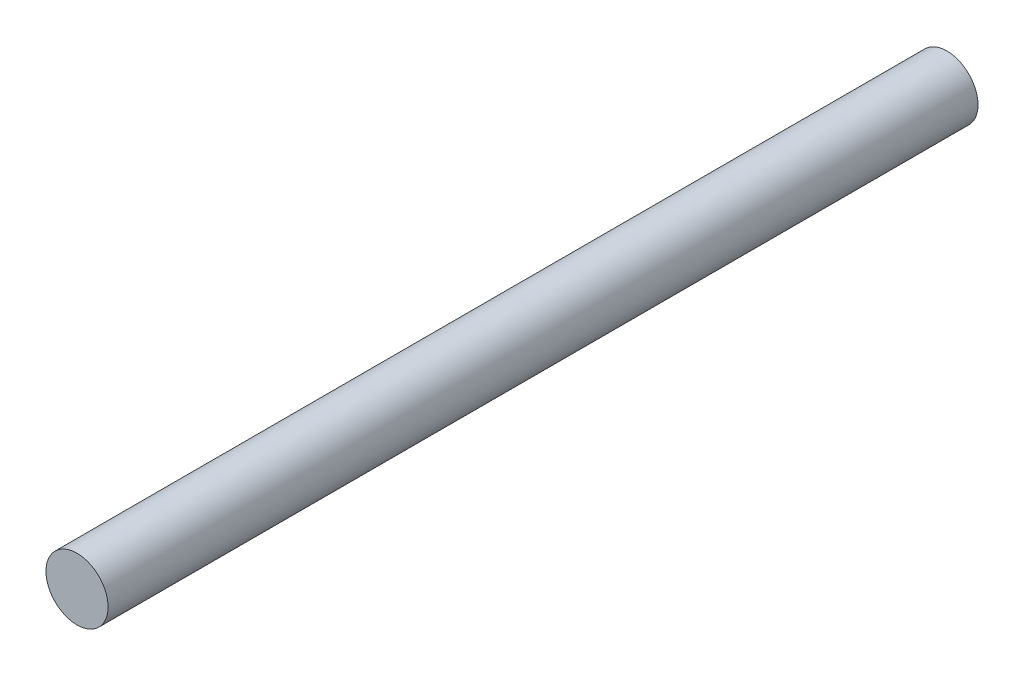
ISO-10303-21;
HEADER;
FILE_DESCRIPTION(('STEP AP214'),'2;1');
FILE_NAME('part.step','',(''),(''),'','','');
FILE_SCHEMA(('AUTOMOTIVE_DESIGN { 1 0 10303 214 1 1 1 1 }'));
ENDSEC;
DATA;
#1=APPLICATION_CONTEXT('core data for automotive mechanical design processes');
#2=APPLICATION_PROTOCOL_DEFINITION('international standard','automotive_design',2000,#1);
#3=PRODUCT_CONTEXT('',#1,'mechanical');
#4=PRODUCT('Part','Part','',(#3));
#5=PRODUCT_RELATED_PRODUCT_CATEGORY('part','',(#4));
#6=PRODUCT_DEFINITION_FORMATION('','',#4);
#7=PRODUCT_DEFINITION_CONTEXT('part definition',#1,'design');
#8=PRODUCT_DEFINITION('design','',#6,#7);
#9=PRODUCT_DEFINITION_SHAPE('','',#8);
#10=(LENGTH_UNIT() NAMED_UNIT(*) SI_UNIT(.MILLI.,.METRE.));
#11=(NAMED_UNIT(*) PLANE_ANGLE_UNIT() SI_UNIT($,.RADIAN.));
#12=(NAMED_UNIT(*) SI_UNIT($,.STERADIAN.) SOLID_ANGLE_UNIT());
#13=UNCERTAINTY_MEASURE_WITH_UNIT(LENGTH_MEASURE(1.E-05),#10,'distance_accuracy_value','');
#14=(GEOMETRIC_REPRESENTATION_CONTEXT(3) GLOBAL_UNCERTAINTY_ASSIGNED_CONTEXT((#13)) GLOBAL_UNIT_ASSIGNED_CONTEXT((#10,
#11,#12)) REPRESENTATION_CONTEXT('',''));
#15=CARTESIAN_POINT('',(0.,0.,0.));
#16=DIRECTION('',(0.,0.,1.));
#17=DIRECTION('',(1.,0.,0.));
#18=AXIS2_PLACEMENT_3D('',#15,#16,#17);
#19=CARTESIAN_POINT('',(0.,0.,7.));
#20=DIRECTION('',(0.,0.,-1.));
#21=DIRECTION('',(-1.,0.,0.));
#22=AXIS2_PLACEMENT_3D('',#19,#20,#21);
#23=CYLINDRICAL_SURFACE('',#22,0.25);
#24=CARTESIAN_POINT('',(0.,0.,7.));
#25=DIRECTION('',(0.,0.,1.));
#26=DIRECTION('',(1.,0.,0.));
#27=AXIS2_PLACEMENT_3D('',#24,#25,#26);
#28=CIRCLE('',#27,0.25);
#29=CARTESIAN_POINT('',(0.25,0.,7.));
#30=VERTEX_POINT('',#29);
#31=EDGE_CURVE('E10',#30,#30,#28,.T.);
#32=ORIENTED_EDGE('',*,*,#31,.F.);
#33=EDGE_LOOP('',(#32));
#34=FACE_BOUND('',#33,.T.);
#35=CARTESIAN_POINT('',(0.,0.,0.));
#36=DIRECTION('',(0.,0.,1.));
#37=DIRECTION('',(1.,0.,0.));
#38=AXIS2_PLACEMENT_3D('',#35,#36,#37);
#39=CIRCLE('',#38,0.25);
#40=CARTESIAN_POINT('',(0.25,0.,0.));
#41=VERTEX_POINT('',#40);
#42=EDGE_CURVE('E44',#41,#41,#39,.T.);
#43=ORIENTED_EDGE('',*,*,#42,.T.);
#44=EDGE_LOOP('',(#43));
#45=FACE_BOUND('',#44,.T.);
#46=ADVANCED_FACE('F41',(#34,#45),#23,.T.);
#47=CARTESIAN_POINT('',(0.,0.,7.));
#48=DIRECTION('',(0.,0.,1.));
#49=DIRECTION('',(1.,0.,0.));
#50=AXIS2_PLACEMENT_3D('',#47,#48,#49);
#51=PLANE('',#50);
#52=ORIENTED_EDGE('',*,*,#31,.T.);
#53=EDGE_LOOP('',(#52));
#54=FACE_BOUND('',#53,.T.);
#55=ADVANCED_FACE('F56',(#54),#51,.T.);
#56=CARTESIAN_POINT('',(0.,0.,0.));
#57=DIRECTION('',(0.,0.,1.));
#58=DIRECTION('',(1.,0.,0.));
#59=AXIS2_PLACEMENT_3D('',#56,#57,#58);
#60=PLANE('',#59);
#61=ORIENTED_EDGE('',*,*,#42,.F.);
#62=EDGE_LOOP('',(#61));
#63=FACE_BOUND('',#62,.T.);
#64=ADVANCED_FACE('F54',(#63),#60,.F.);
#65=CLOSED_SHELL('',(#46,#55,#64));
#66=MANIFOLD_SOLID_BREP('B2',#65);
#67=ADVANCED_BREP_SHAPE_REPRESENTATION('',(#18,#66),#14);
#68=SHAPE_DEFINITION_REPRESENTATION(#9,#67);
ENDSEC;
END-ISO-10303-21;
